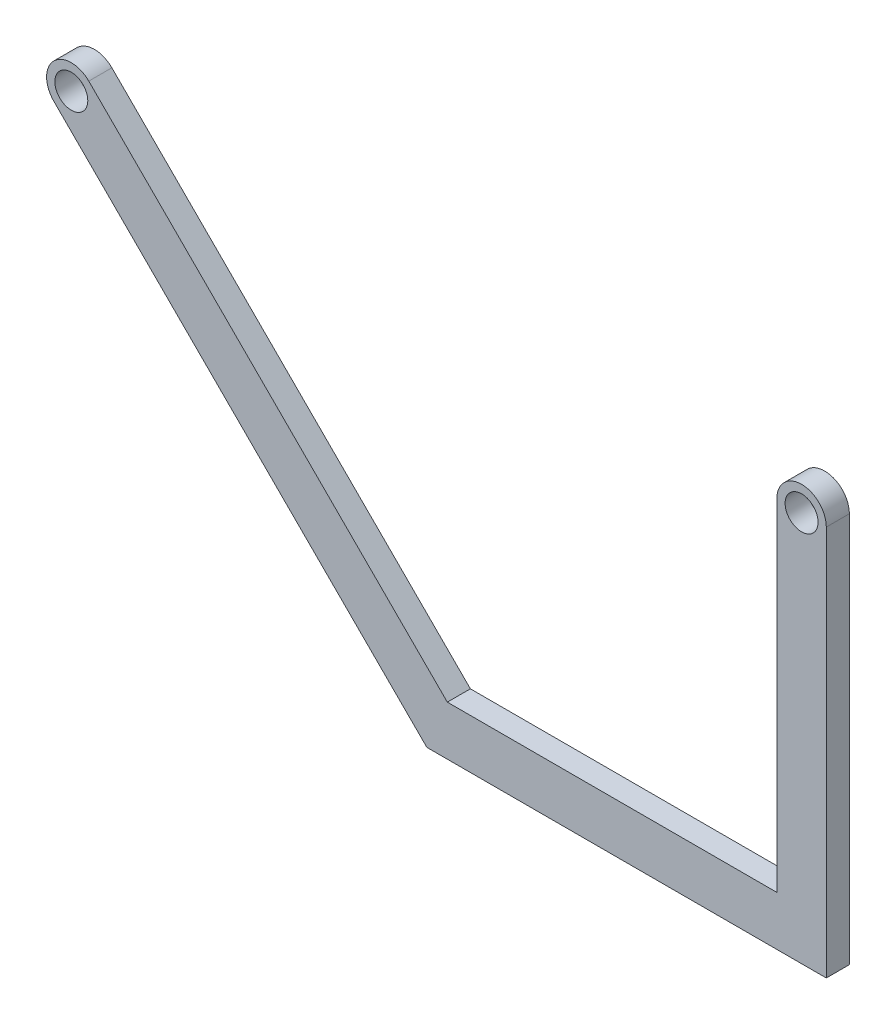
ISO-10303-21;
HEADER;
FILE_DESCRIPTION(('STEP AP214'),'2;1');
FILE_NAME('part.step','',(''),(''),'','','');
FILE_SCHEMA(('AUTOMOTIVE_DESIGN { 1 0 10303 214 1 1 1 1 }'));
ENDSEC;
DATA;
#1=APPLICATION_CONTEXT('core data for automotive mechanical design processes');
#2=APPLICATION_PROTOCOL_DEFINITION('international standard','automotive_design',2000,#1);
#3=PRODUCT_CONTEXT('',#1,'mechanical');
#4=PRODUCT('Part','Part','',(#3));
#5=PRODUCT_RELATED_PRODUCT_CATEGORY('part','',(#4));
#6=PRODUCT_DEFINITION_FORMATION('','',#4);
#7=PRODUCT_DEFINITION_CONTEXT('part definition',#1,'design');
#8=PRODUCT_DEFINITION('design','',#6,#7);
#9=PRODUCT_DEFINITION_SHAPE('','',#8);
#10=(LENGTH_UNIT() NAMED_UNIT(*) SI_UNIT(.MILLI.,.METRE.));
#11=(NAMED_UNIT(*) PLANE_ANGLE_UNIT() SI_UNIT($,.RADIAN.));
#12=(NAMED_UNIT(*) SI_UNIT($,.STERADIAN.) SOLID_ANGLE_UNIT());
#13=UNCERTAINTY_MEASURE_WITH_UNIT(LENGTH_MEASURE(1.E-05),#10,'distance_accuracy_value','');
#14=(GEOMETRIC_REPRESENTATION_CONTEXT(3) GLOBAL_UNCERTAINTY_ASSIGNED_CONTEXT((#13)) GLOBAL_UNIT_ASSIGNED_CONTEXT((#10,
#11,#12)) REPRESENTATION_CONTEXT('',''));
#15=CARTESIAN_POINT('',(0.,0.,0.));
#16=DIRECTION('',(0.,0.,1.));
#17=DIRECTION('',(1.,0.,0.));
#18=AXIS2_PLACEMENT_3D('',#15,#16,#17);
#19=CARTESIAN_POINT('',(53.9563073452827,120.396,-3.556));
#20=DIRECTION('',(0.,0.,1.));
#21=DIRECTION('',(1.,0.,0.));
#22=AXIS2_PLACEMENT_3D('',#19,#20,#21);
#23=CYLINDRICAL_SURFACE('',#22,7.62);
#24=DIRECTION('',(0.,0.,1.));
#25=VECTOR('',#24,1.);
#26=CARTESIAN_POINT('',(46.3363073452828,120.396,-3.556));
#27=LINE('',#26,#25);
#28=CARTESIAN_POINT('',(46.3363073452828,120.396,-3.556));
#29=VERTEX_POINT('',#28);
#30=CARTESIAN_POINT('',(46.3363073452828,120.396,3.556));
#31=VERTEX_POINT('',#30);
#32=EDGE_CURVE('E44',#29,#31,#27,.T.);
#33=ORIENTED_EDGE('',*,*,#32,.T.);
#34=CARTESIAN_POINT('',(53.9563073452827,120.396,3.556));
#35=DIRECTION('',(0.,0.,1.));
#36=DIRECTION('',(-1.,0.,0.));
#37=AXIS2_PLACEMENT_3D('',#34,#35,#36);
#38=CIRCLE('',#37,7.62);
#39=CARTESIAN_POINT('',(61.5763073452828,120.396,3.556));
#40=VERTEX_POINT('',#39);
#41=EDGE_CURVE('E105',#40,#31,#38,.T.);
#42=ORIENTED_EDGE('',*,*,#41,.F.);
#43=DIRECTION('',(0.,0.,1.));
#44=VECTOR('',#43,1.);
#45=CARTESIAN_POINT('',(61.5763073452828,120.396,-3.556));
#46=LINE('',#45,#44);
#47=CARTESIAN_POINT('',(61.5763073452828,120.396,-3.556));
#48=VERTEX_POINT('',#47);
#49=EDGE_CURVE('E11',#48,#40,#46,.T.);
#50=ORIENTED_EDGE('',*,*,#49,.F.);
#51=CARTESIAN_POINT('',(53.9563073452827,120.396,-3.556));
#52=DIRECTION('',(0.,0.,1.));
#53=DIRECTION('',(-1.,0.,0.));
#54=AXIS2_PLACEMENT_3D('',#51,#52,#53);
#55=CIRCLE('',#54,7.62);
#56=EDGE_CURVE('E106',#48,#29,#55,.T.);
#57=ORIENTED_EDGE('',*,*,#56,.T.);
#58=EDGE_LOOP('',(#33,#42,#50,#57));
#59=FACE_BOUND('',#58,.T.);
#60=ADVANCED_FACE('F41',(#59),#23,.T.);
#61=CARTESIAN_POINT('',(61.5763073452828,120.396,-3.556));
#62=DIRECTION('',(1.,0.,0.));
#63=DIRECTION('',(0.,1.,0.));
#64=AXIS2_PLACEMENT_3D('',#61,#62,#63);
#65=PLANE('',#64);
#66=ORIENTED_EDGE('',*,*,#49,.T.);
#67=DIRECTION('',(0.,1.,0.));
#68=VECTOR('',#67,1.);
#69=CARTESIAN_POINT('',(61.5763073452828,120.396,3.556));
#70=LINE('',#69,#68);
#71=CARTESIAN_POINT('',(61.576307345283,0.,3.556));
#72=VERTEX_POINT('',#71);
#73=EDGE_CURVE('E123',#72,#40,#70,.T.);
#74=ORIENTED_EDGE('',*,*,#73,.F.);
#75=DIRECTION('',(0.,0.,1.));
#76=VECTOR('',#75,1.);
#77=CARTESIAN_POINT('',(61.576307345283,0.,-3.556));
#78=LINE('',#77,#76);
#79=CARTESIAN_POINT('',(61.576307345283,0.,-3.556));
#80=VERTEX_POINT('',#79);
#81=EDGE_CURVE('E49',#80,#72,#78,.T.);
#82=ORIENTED_EDGE('',*,*,#81,.F.);
#83=DIRECTION('',(0.,1.,0.));
#84=VECTOR('',#83,1.);
#85=CARTESIAN_POINT('',(61.5763073452828,120.396,-3.556));
#86=LINE('',#85,#84);
#87=EDGE_CURVE('E111',#80,#48,#86,.T.);
#88=ORIENTED_EDGE('',*,*,#87,.T.);
#89=EDGE_LOOP('',(#66,#74,#82,#88));
#90=FACE_BOUND('',#89,.T.);
#91=ADVANCED_FACE('F192',(#90),#65,.T.);
#92=CARTESIAN_POINT('',(-61.576307345283,0.,-3.556));
#93=DIRECTION('',(0.,-1.,0.));
#94=DIRECTION('',(1.,0.,0.));
#95=AXIS2_PLACEMENT_3D('',#92,#93,#94);
#96=PLANE('',#95);
#97=ORIENTED_EDGE('',*,*,#81,.T.);
#98=DIRECTION('',(1.,0.,0.));
#99=VECTOR('',#98,1.);
#100=CARTESIAN_POINT('',(-61.576307345283,0.,3.556));
#101=LINE('',#100,#99);
#102=CARTESIAN_POINT('',(-61.576307345283,0.,3.556));
#103=VERTEX_POINT('',#102);
#104=EDGE_CURVE('E141',#103,#72,#101,.T.);
#105=ORIENTED_EDGE('',*,*,#104,.F.);
#106=DIRECTION('',(0.,0.,1.));
#107=VECTOR('',#106,1.);
#108=CARTESIAN_POINT('',(-61.576307345283,0.,-3.556));
#109=LINE('',#108,#107);
#110=CARTESIAN_POINT('',(-61.576307345283,0.,-3.556));
#111=VERTEX_POINT('',#110);
#112=EDGE_CURVE('E163',#111,#103,#109,.T.);
#113=ORIENTED_EDGE('',*,*,#112,.F.);
#114=DIRECTION('',(1.,0.,0.));
#115=VECTOR('',#114,1.);
#116=CARTESIAN_POINT('',(-61.576307345283,0.,-3.556));
#117=LINE('',#116,#115);
#118=EDGE_CURVE('E159',#111,#80,#117,.T.);
#119=ORIENTED_EDGE('',*,*,#118,.T.);
#120=EDGE_LOOP('',(#97,#105,#113,#119));
#121=FACE_BOUND('',#120,.T.);
#122=ADVANCED_FACE('F191',(#121),#96,.T.);
#123=CARTESIAN_POINT('',(-176.584153672642,115.007846327359,-3.556));
#124=DIRECTION('',(-0.707106781186548,-0.707106781186547,0.));
#125=DIRECTION('',(0.707106781186547,-0.707106781186548,0.));
#126=AXIS2_PLACEMENT_3D('',#123,#124,#125);
#127=PLANE('',#126);
#128=ORIENTED_EDGE('',*,*,#112,.T.);
#129=DIRECTION('',(0.707106781186547,-0.707106781186548,0.));
#130=VECTOR('',#129,1.);
#131=CARTESIAN_POINT('',(-176.584153672642,115.007846327359,3.556));
#132=LINE('',#131,#130);
#133=CARTESIAN_POINT('',(-176.584153672642,115.007846327359,3.556));
#134=VERTEX_POINT('',#133);
#135=EDGE_CURVE('E138',#134,#103,#132,.T.);
#136=ORIENTED_EDGE('',*,*,#135,.F.);
#137=DIRECTION('',(0.,0.,1.));
#138=VECTOR('',#137,1.);
#139=CARTESIAN_POINT('',(-176.584153672642,115.007846327359,-3.556));
#140=LINE('',#139,#138);
#141=CARTESIAN_POINT('',(-176.584153672642,115.007846327359,-3.556));
#142=VERTEX_POINT('',#141);
#143=EDGE_CURVE('E165',#142,#134,#140,.T.);
#144=ORIENTED_EDGE('',*,*,#143,.F.);
#145=DIRECTION('',(0.707106781186547,-0.707106781186548,0.));
#146=VECTOR('',#145,1.);
#147=CARTESIAN_POINT('',(-176.584153672642,115.007846327359,-3.556));
#148=LINE('',#147,#146);
#149=EDGE_CURVE('E156',#142,#111,#148,.T.);
#150=ORIENTED_EDGE('',*,*,#149,.T.);
#151=EDGE_LOOP('',(#128,#136,#144,#150));
#152=FACE_BOUND('',#151,.T.);
#153=ADVANCED_FACE('F187',(#152),#127,.T.);
#154=CARTESIAN_POINT('',(-171.196,120.396,-3.556));
#155=DIRECTION('',(0.,0.,1.));
#156=DIRECTION('',(1.,0.,0.));
#157=AXIS2_PLACEMENT_3D('',#154,#155,#156);
#158=CYLINDRICAL_SURFACE('',#157,7.61999999999997);
#159=ORIENTED_EDGE('',*,*,#143,.T.);
#160=CARTESIAN_POINT('',(-171.196,120.396,3.556));
#161=DIRECTION('',(0.,0.,1.));
#162=DIRECTION('',(1.,0.,0.));
#163=AXIS2_PLACEMENT_3D('',#160,#161,#162);
#164=CIRCLE('',#163,7.61999999999997);
#165=CARTESIAN_POINT('',(-165.807846327359,125.784153672642,3.556));
#166=VERTEX_POINT('',#165);
#167=EDGE_CURVE('E135',#166,#134,#164,.T.);
#168=ORIENTED_EDGE('',*,*,#167,.F.);
#169=DIRECTION('',(0.,0.,1.));
#170=VECTOR('',#169,1.);
#171=CARTESIAN_POINT('',(-165.807846327359,125.784153672642,-3.556));
#172=LINE('',#171,#170);
#173=CARTESIAN_POINT('',(-165.807846327359,125.784153672642,-3.556));
#174=VERTEX_POINT('',#173);
#175=EDGE_CURVE('E167',#174,#166,#172,.T.);
#176=ORIENTED_EDGE('',*,*,#175,.F.);
#177=CARTESIAN_POINT('',(-171.196,120.396,-3.556));
#178=DIRECTION('',(0.,0.,1.));
#179=DIRECTION('',(1.,0.,0.));
#180=AXIS2_PLACEMENT_3D('',#177,#178,#179);
#181=CIRCLE('',#180,7.61999999999997);
#182=EDGE_CURVE('E153',#174,#142,#181,.T.);
#183=ORIENTED_EDGE('',*,*,#182,.T.);
#184=EDGE_LOOP('',(#159,#168,#176,#183));
#185=FACE_BOUND('',#184,.T.);
#186=ADVANCED_FACE('F180',(#185),#158,.T.);
#187=CARTESIAN_POINT('',(-55.263692654717,15.24,-3.556));
#188=DIRECTION('',(0.707106781186548,0.707106781186547,0.));
#189=DIRECTION('',(-0.707106781186547,0.707106781186548,0.));
#190=AXIS2_PLACEMENT_3D('',#187,#188,#189);
#191=PLANE('',#190);
#192=ORIENTED_EDGE('',*,*,#175,.T.);
#193=DIRECTION('',(-0.707106781186547,0.707106781186548,0.));
#194=VECTOR('',#193,1.);
#195=CARTESIAN_POINT('',(-55.263692654717,15.24,3.556));
#196=LINE('',#195,#194);
#197=CARTESIAN_POINT('',(-55.263692654717,15.24,3.556));
#198=VERTEX_POINT('',#197);
#199=EDGE_CURVE('E132',#198,#166,#196,.T.);
#200=ORIENTED_EDGE('',*,*,#199,.F.);
#201=DIRECTION('',(0.,0.,1.));
#202=VECTOR('',#201,1.);
#203=CARTESIAN_POINT('',(-55.263692654717,15.24,-3.556));
#204=LINE('',#203,#202);
#205=CARTESIAN_POINT('',(-55.263692654717,15.24,-3.556));
#206=VERTEX_POINT('',#205);
#207=EDGE_CURVE('E169',#206,#198,#204,.T.);
#208=ORIENTED_EDGE('',*,*,#207,.F.);
#209=DIRECTION('',(-0.707106781186547,0.707106781186548,0.));
#210=VECTOR('',#209,1.);
#211=CARTESIAN_POINT('',(-55.263692654717,15.24,-3.556));
#212=LINE('',#211,#210);
#213=EDGE_CURVE('E150',#206,#174,#212,.T.);
#214=ORIENTED_EDGE('',*,*,#213,.T.);
#215=EDGE_LOOP('',(#192,#200,#208,#214));
#216=FACE_BOUND('',#215,.T.);
#217=ADVANCED_FACE('F177',(#216),#191,.T.);
#218=CARTESIAN_POINT('',(46.336307345283,15.24,-3.556));
#219=DIRECTION('',(0.,1.,0.));
#220=DIRECTION('',(-1.,0.,0.));
#221=AXIS2_PLACEMENT_3D('',#218,#219,#220);
#222=PLANE('',#221);
#223=ORIENTED_EDGE('',*,*,#207,.T.);
#224=DIRECTION('',(-1.,0.,0.));
#225=VECTOR('',#224,1.);
#226=CARTESIAN_POINT('',(46.336307345283,15.24,3.556));
#227=LINE('',#226,#225);
#228=CARTESIAN_POINT('',(46.336307345283,15.24,3.556));
#229=VERTEX_POINT('',#228);
#230=EDGE_CURVE('E118',#229,#198,#227,.T.);
#231=ORIENTED_EDGE('',*,*,#230,.F.);
#232=DIRECTION('',(0.,0.,1.));
#233=VECTOR('',#232,1.);
#234=CARTESIAN_POINT('',(46.336307345283,15.24,-3.556));
#235=LINE('',#234,#233);
#236=CARTESIAN_POINT('',(46.336307345283,15.24,-3.556));
#237=VERTEX_POINT('',#236);
#238=EDGE_CURVE('E110',#237,#229,#235,.T.);
#239=ORIENTED_EDGE('',*,*,#238,.F.);
#240=DIRECTION('',(-1.,0.,0.));
#241=VECTOR('',#240,1.);
#242=CARTESIAN_POINT('',(46.336307345283,15.24,-3.556));
#243=LINE('',#242,#241);
#244=EDGE_CURVE('E147',#237,#206,#243,.T.);
#245=ORIENTED_EDGE('',*,*,#244,.T.);
#246=EDGE_LOOP('',(#223,#231,#239,#245));
#247=FACE_BOUND('',#246,.T.);
#248=ADVANCED_FACE('F171',(#247),#222,.T.);
#249=CARTESIAN_POINT('',(46.3363073452828,120.396,-3.556));
#250=DIRECTION('',(-1.,0.,0.));
#251=DIRECTION('',(0.,-1.,0.));
#252=AXIS2_PLACEMENT_3D('',#249,#250,#251);
#253=PLANE('',#252);
#254=ORIENTED_EDGE('',*,*,#238,.T.);
#255=DIRECTION('',(0.,-1.,0.));
#256=VECTOR('',#255,1.);
#257=CARTESIAN_POINT('',(46.3363073452828,120.396,3.556));
#258=LINE('',#257,#256);
#259=EDGE_CURVE('E113',#31,#229,#258,.T.);
#260=ORIENTED_EDGE('',*,*,#259,.F.);
#261=ORIENTED_EDGE('',*,*,#32,.F.);
#262=DIRECTION('',(0.,-1.,0.));
#263=VECTOR('',#262,1.);
#264=CARTESIAN_POINT('',(46.3363073452828,120.396,-3.556));
#265=LINE('',#264,#263);
#266=EDGE_CURVE('E145',#29,#237,#265,.T.);
#267=ORIENTED_EDGE('',*,*,#266,.T.);
#268=EDGE_LOOP('',(#254,#260,#261,#267));
#269=FACE_BOUND('',#268,.T.);
#270=ADVANCED_FACE('F114',(#269),#253,.T.);
#271=CARTESIAN_POINT('',(53.9563073452827,120.396,-3.556));
#272=DIRECTION('',(0.,0.,-1.));
#273=DIRECTION('',(-1.,0.,0.));
#274=AXIS2_PLACEMENT_3D('',#271,#272,#273);
#275=PLANE('',#274);
#276=CARTESIAN_POINT('',(-171.196,120.396,-3.556));
#277=DIRECTION('',(0.,0.,1.));
#278=DIRECTION('',(1.,0.,0.));
#279=AXIS2_PLACEMENT_3D('',#276,#277,#278);
#280=CIRCLE('',#279,5.08);
#281=CARTESIAN_POINT('',(-166.116,120.396,-3.556));
#282=VERTEX_POINT('',#281);
#283=EDGE_CURVE('E223',#282,#282,#280,.T.);
#284=ORIENTED_EDGE('',*,*,#283,.T.);
#285=EDGE_LOOP('',(#284));
#286=FACE_BOUND('',#285,.T.);
#287=CARTESIAN_POINT('',(53.9563073452827,120.396,-3.556));
#288=DIRECTION('',(0.,0.,1.));
#289=DIRECTION('',(1.,0.,0.));
#290=AXIS2_PLACEMENT_3D('',#287,#288,#289);
#291=CIRCLE('',#290,5.08);
#292=CARTESIAN_POINT('',(59.0363073452828,120.396,-3.556));
#293=VERTEX_POINT('',#292);
#294=EDGE_CURVE('E124',#293,#293,#291,.T.);
#295=ORIENTED_EDGE('',*,*,#294,.T.);
#296=EDGE_LOOP('',(#295));
#297=FACE_BOUND('',#296,.T.);
#298=ORIENTED_EDGE('',*,*,#56,.F.);
#299=ORIENTED_EDGE('',*,*,#87,.F.);
#300=ORIENTED_EDGE('',*,*,#118,.F.);
#301=ORIENTED_EDGE('',*,*,#149,.F.);
#302=ORIENTED_EDGE('',*,*,#182,.F.);
#303=ORIENTED_EDGE('',*,*,#213,.F.);
#304=ORIENTED_EDGE('',*,*,#244,.F.);
#305=ORIENTED_EDGE('',*,*,#266,.F.);
#306=EDGE_LOOP('',(#298,#299,#300,#301,#302,#303,#304,#305));
#307=FACE_BOUND('',#306,.T.);
#308=ADVANCED_FACE('F183',(#286,#297,#307),#275,.T.);
#309=CARTESIAN_POINT('',(53.9563073452827,120.396,3.556));
#310=DIRECTION('',(0.,0.,-1.));
#311=DIRECTION('',(-1.,0.,0.));
#312=AXIS2_PLACEMENT_3D('',#309,#310,#311);
#313=PLANE('',#312);
#314=CARTESIAN_POINT('',(-171.196,120.396,3.556));
#315=DIRECTION('',(0.,0.,1.));
#316=DIRECTION('',(1.,0.,0.));
#317=AXIS2_PLACEMENT_3D('',#314,#315,#316);
#318=CIRCLE('',#317,5.08);
#319=CARTESIAN_POINT('',(-166.116,120.396,3.556));
#320=VERTEX_POINT('',#319);
#321=EDGE_CURVE('E233',#320,#320,#318,.T.);
#322=ORIENTED_EDGE('',*,*,#321,.F.);
#323=EDGE_LOOP('',(#322));
#324=FACE_BOUND('',#323,.T.);
#325=CARTESIAN_POINT('',(53.9563073452827,120.396,3.556));
#326=DIRECTION('',(0.,0.,1.));
#327=DIRECTION('',(1.,0.,0.));
#328=AXIS2_PLACEMENT_3D('',#325,#326,#327);
#329=CIRCLE('',#328,5.08);
#330=CARTESIAN_POINT('',(59.0363073452828,120.396,3.556));
#331=VERTEX_POINT('',#330);
#332=EDGE_CURVE('E127',#331,#331,#329,.T.);
#333=ORIENTED_EDGE('',*,*,#332,.F.);
#334=EDGE_LOOP('',(#333));
#335=FACE_BOUND('',#334,.T.);
#336=ORIENTED_EDGE('',*,*,#41,.T.);
#337=ORIENTED_EDGE('',*,*,#259,.T.);
#338=ORIENTED_EDGE('',*,*,#230,.T.);
#339=ORIENTED_EDGE('',*,*,#199,.T.);
#340=ORIENTED_EDGE('',*,*,#167,.T.);
#341=ORIENTED_EDGE('',*,*,#135,.T.);
#342=ORIENTED_EDGE('',*,*,#104,.T.);
#343=ORIENTED_EDGE('',*,*,#73,.T.);
#344=EDGE_LOOP('',(#336,#337,#338,#339,#340,#341,#342,#343));
#345=FACE_BOUND('',#344,.T.);
#346=ADVANCED_FACE('F121',(#324,#335,#345),#313,.F.);
#347=CARTESIAN_POINT('',(53.9563073452827,120.396,3.556));
#348=DIRECTION('',(0.,0.,1.));
#349=DIRECTION('',(1.,0.,0.));
#350=AXIS2_PLACEMENT_3D('',#347,#348,#349);
#351=CYLINDRICAL_SURFACE('',#350,5.08);
#352=ORIENTED_EDGE('',*,*,#294,.F.);
#353=EDGE_LOOP('',(#352));
#354=FACE_BOUND('',#353,.T.);
#355=ORIENTED_EDGE('',*,*,#332,.T.);
#356=EDGE_LOOP('',(#355));
#357=FACE_BOUND('',#356,.T.);
#358=ADVANCED_FACE('F218',(#354,#357),#351,.F.);
#359=CARTESIAN_POINT('',(-171.196,120.396,3.556));
#360=DIRECTION('',(0.,0.,1.));
#361=DIRECTION('',(1.,0.,0.));
#362=AXIS2_PLACEMENT_3D('',#359,#360,#361);
#363=CYLINDRICAL_SURFACE('',#362,5.08);
#364=ORIENTED_EDGE('',*,*,#283,.F.);
#365=EDGE_LOOP('',(#364));
#366=FACE_BOUND('',#365,.T.);
#367=ORIENTED_EDGE('',*,*,#321,.T.);
#368=EDGE_LOOP('',(#367));
#369=FACE_BOUND('',#368,.T.);
#370=ADVANCED_FACE('F228',(#366,#369),#363,.F.);
#371=CLOSED_SHELL('',(#60,#91,#122,#153,#186,#217,#248,#270,#308,#346,#358,#370));
#372=MANIFOLD_SOLID_BREP('B2',#371);
#373=ADVANCED_BREP_SHAPE_REPRESENTATION('',(#18,#372),#14);
#374=SHAPE_DEFINITION_REPRESENTATION(#9,#373);
ENDSEC;
END-ISO-10303-21;
